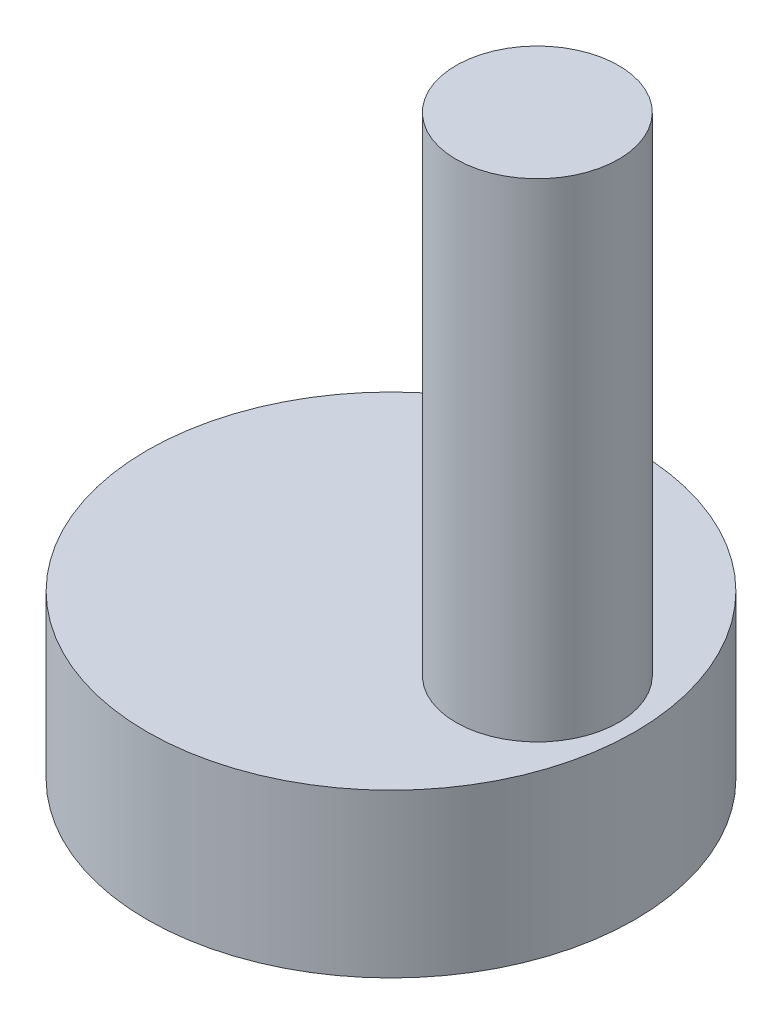
ISO-10303-21;
HEADER;
FILE_DESCRIPTION(('STEP AP214'),'2;1');
FILE_NAME('part.step','',(''),(''),'','','');
FILE_SCHEMA(('AUTOMOTIVE_DESIGN { 1 0 10303 214 1 1 1 1 }'));
ENDSEC;
DATA;
#1=APPLICATION_CONTEXT('core data for automotive mechanical design processes');
#2=APPLICATION_PROTOCOL_DEFINITION('international standard','automotive_design',2000,#1);
#3=PRODUCT_CONTEXT('',#1,'mechanical');
#4=PRODUCT('Part','Part','',(#3));
#5=PRODUCT_RELATED_PRODUCT_CATEGORY('part','',(#4));
#6=PRODUCT_DEFINITION_FORMATION('','',#4);
#7=PRODUCT_DEFINITION_CONTEXT('part definition',#1,'design');
#8=PRODUCT_DEFINITION('design','',#6,#7);
#9=PRODUCT_DEFINITION_SHAPE('','',#8);
#10=(LENGTH_UNIT() NAMED_UNIT(*) SI_UNIT(.MILLI.,.METRE.));
#11=(NAMED_UNIT(*) PLANE_ANGLE_UNIT() SI_UNIT($,.RADIAN.));
#12=(NAMED_UNIT(*) SI_UNIT($,.STERADIAN.) SOLID_ANGLE_UNIT());
#13=UNCERTAINTY_MEASURE_WITH_UNIT(LENGTH_MEASURE(1.E-05),#10,'distance_accuracy_value','');
#14=(GEOMETRIC_REPRESENTATION_CONTEXT(3) GLOBAL_UNCERTAINTY_ASSIGNED_CONTEXT((#13)) GLOBAL_UNIT_ASSIGNED_CONTEXT((#10,
#11,#12)) REPRESENTATION_CONTEXT('',''));
#15=CARTESIAN_POINT('',(0.,0.,0.));
#16=DIRECTION('',(0.,0.,1.));
#17=DIRECTION('',(1.,0.,0.));
#18=AXIS2_PLACEMENT_3D('',#15,#16,#17);
#19=CARTESIAN_POINT('',(0.,10.,0.));
#20=DIRECTION('',(0.,-1.,0.));
#21=DIRECTION('',(0.,0.,-1.));
#22=AXIS2_PLACEMENT_3D('',#19,#20,#21);
#23=CYLINDRICAL_SURFACE('',#22,15.);
#24=CARTESIAN_POINT('',(0.,10.,0.));
#25=DIRECTION('',(0.,1.,0.));
#26=DIRECTION('',(0.,0.,1.));
#27=AXIS2_PLACEMENT_3D('',#24,#25,#26);
#28=CIRCLE('',#27,15.);
#29=CARTESIAN_POINT('',(0.,10.,15.));
#30=VERTEX_POINT('',#29);
#31=EDGE_CURVE('E10',#30,#30,#28,.T.);
#32=ORIENTED_EDGE('',*,*,#31,.F.);
#33=EDGE_LOOP('',(#32));
#34=FACE_BOUND('',#33,.T.);
#35=CARTESIAN_POINT('',(0.,0.,0.));
#36=DIRECTION('',(0.,1.,0.));
#37=DIRECTION('',(0.,0.,1.));
#38=AXIS2_PLACEMENT_3D('',#35,#36,#37);
#39=CIRCLE('',#38,15.);
#40=CARTESIAN_POINT('',(0.,0.,15.));
#41=VERTEX_POINT('',#40);
#42=EDGE_CURVE('E44',#41,#41,#39,.T.);
#43=ORIENTED_EDGE('',*,*,#42,.T.);
#44=EDGE_LOOP('',(#43));
#45=FACE_BOUND('',#44,.T.);
#46=ADVANCED_FACE('F41',(#34,#45),#23,.T.);
#47=CARTESIAN_POINT('',(0.,10.,0.));
#48=DIRECTION('',(0.,1.,0.));
#49=DIRECTION('',(0.,0.,1.));
#50=AXIS2_PLACEMENT_3D('',#47,#48,#49);
#51=PLANE('',#50);
#52=CARTESIAN_POINT('',(9.,10.,0.));
#53=DIRECTION('',(0.,1.,0.));
#54=DIRECTION('',(0.,0.,1.));
#55=AXIS2_PLACEMENT_3D('',#52,#53,#54);
#56=CIRCLE('',#55,5.);
#57=CARTESIAN_POINT('',(9.,10.,5.));
#58=VERTEX_POINT('',#57);
#59=EDGE_CURVE('E55',#58,#58,#56,.T.);
#60=ORIENTED_EDGE('',*,*,#59,.F.);
#61=EDGE_LOOP('',(#60));
#62=FACE_BOUND('',#61,.T.);
#63=ORIENTED_EDGE('',*,*,#31,.T.);
#64=EDGE_LOOP('',(#63));
#65=FACE_BOUND('',#64,.T.);
#66=ADVANCED_FACE('F72',(#62,#65),#51,.T.);
#67=CARTESIAN_POINT('',(0.,0.,0.));
#68=DIRECTION('',(0.,1.,0.));
#69=DIRECTION('',(0.,0.,1.));
#70=AXIS2_PLACEMENT_3D('',#67,#68,#69);
#71=PLANE('',#70);
#72=ORIENTED_EDGE('',*,*,#42,.F.);
#73=EDGE_LOOP('',(#72));
#74=FACE_BOUND('',#73,.T.);
#75=ADVANCED_FACE('F68',(#74),#71,.F.);
#76=CARTESIAN_POINT('',(9.,40.,0.));
#77=DIRECTION('',(0.,-1.,0.));
#78=DIRECTION('',(0.,0.,-1.));
#79=AXIS2_PLACEMENT_3D('',#76,#77,#78);
#80=CYLINDRICAL_SURFACE('',#79,5.);
#81=CARTESIAN_POINT('',(9.,40.,0.));
#82=DIRECTION('',(0.,1.,0.));
#83=DIRECTION('',(0.,0.,1.));
#84=AXIS2_PLACEMENT_3D('',#81,#82,#83);
#85=CIRCLE('',#84,5.);
#86=CARTESIAN_POINT('',(9.,40.,5.));
#87=VERTEX_POINT('',#86);
#88=EDGE_CURVE('E53',#87,#87,#85,.T.);
#89=ORIENTED_EDGE('',*,*,#88,.F.);
#90=EDGE_LOOP('',(#89));
#91=FACE_BOUND('',#90,.T.);
#92=ORIENTED_EDGE('',*,*,#59,.T.);
#93=EDGE_LOOP('',(#92));
#94=FACE_BOUND('',#93,.T.);
#95=ADVANCED_FACE('F65',(#91,#94),#80,.T.);
#96=CARTESIAN_POINT('',(9.,40.,0.));
#97=DIRECTION('',(0.,1.,0.));
#98=DIRECTION('',(0.,0.,1.));
#99=AXIS2_PLACEMENT_3D('',#96,#97,#98);
#100=PLANE('',#99);
#101=ORIENTED_EDGE('',*,*,#88,.T.);
#102=EDGE_LOOP('',(#101));
#103=FACE_BOUND('',#102,.T.);
#104=ADVANCED_FACE('F63',(#103),#100,.T.);
#105=CLOSED_SHELL('',(#46,#66,#75,#95,#104));
#106=MANIFOLD_SOLID_BREP('B2',#105);
#107=ADVANCED_BREP_SHAPE_REPRESENTATION('',(#18,#106),#14);
#108=SHAPE_DEFINITION_REPRESENTATION(#9,#107);
ENDSEC;
END-ISO-10303-21;
